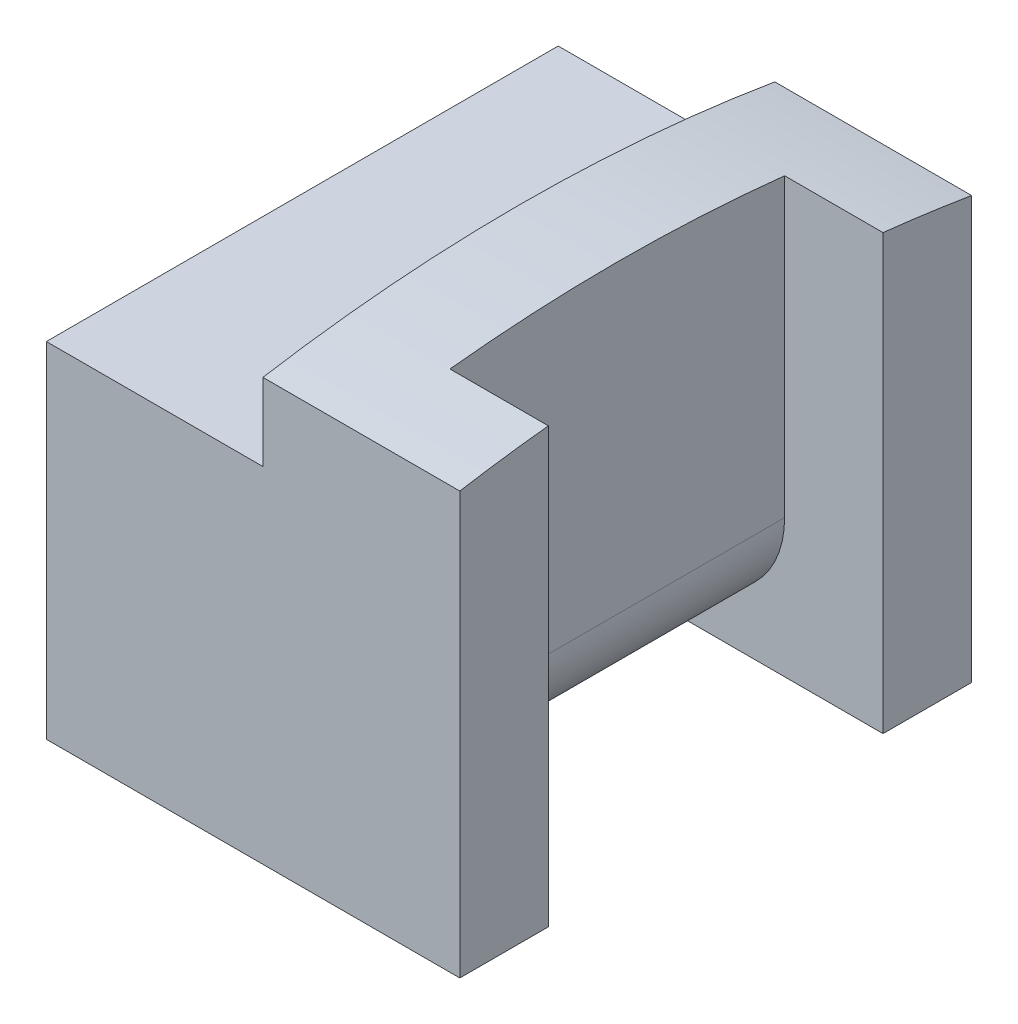
ISO-10303-21;
HEADER;
FILE_DESCRIPTION(('STEP AP214'),'2;1');
FILE_NAME('part.step','',(''),(''),'','','');
FILE_SCHEMA(('AUTOMOTIVE_DESIGN { 1 0 10303 214 1 1 1 1 }'));
ENDSEC;
DATA;
#1=APPLICATION_CONTEXT('core data for automotive mechanical design processes');
#2=APPLICATION_PROTOCOL_DEFINITION('international standard','automotive_design',2000,#1);
#3=PRODUCT_CONTEXT('',#1,'mechanical');
#4=PRODUCT('Part','Part','',(#3));
#5=PRODUCT_RELATED_PRODUCT_CATEGORY('part','',(#4));
#6=PRODUCT_DEFINITION_FORMATION('','',#4);
#7=PRODUCT_DEFINITION_CONTEXT('part definition',#1,'design');
#8=PRODUCT_DEFINITION('design','',#6,#7);
#9=PRODUCT_DEFINITION_SHAPE('','',#8);
#10=(LENGTH_UNIT() NAMED_UNIT(*) SI_UNIT(.MILLI.,.METRE.));
#11=(NAMED_UNIT(*) PLANE_ANGLE_UNIT() SI_UNIT($,.RADIAN.));
#12=(NAMED_UNIT(*) SI_UNIT($,.STERADIAN.) SOLID_ANGLE_UNIT());
#13=UNCERTAINTY_MEASURE_WITH_UNIT(LENGTH_MEASURE(1.E-05),#10,'distance_accuracy_value','');
#14=(GEOMETRIC_REPRESENTATION_CONTEXT(3) GLOBAL_UNCERTAINTY_ASSIGNED_CONTEXT((#13)) GLOBAL_UNIT_ASSIGNED_CONTEXT((#10,
#11,#12)) REPRESENTATION_CONTEXT('',''));
#15=CARTESIAN_POINT('',(0.,0.,0.));
#16=DIRECTION('',(0.,0.,1.));
#17=DIRECTION('',(1.,0.,0.));
#18=AXIS2_PLACEMENT_3D('',#15,#16,#17);
#19=CARTESIAN_POINT('',(59.6132183908046,6.7117816091954,-0.85));
#20=DIRECTION('',(0.,0.,-1.));
#21=DIRECTION('',(-1.,0.,0.));
#22=AXIS2_PLACEMENT_3D('',#19,#20,#21);
#23=PLANE('',#22);
#24=DIRECTION('',(0.,1.,0.));
#25=VECTOR('',#24,1.);
#26=CARTESIAN_POINT('',(60.1,6.35,-0.85));
#27=LINE('',#26,#25);
#28=CARTESIAN_POINT('',(60.1,6.35,-0.85));
#29=VERTEX_POINT('',#28);
#30=CARTESIAN_POINT('',(60.1,7.8541390362025,-0.85));
#31=VERTEX_POINT('',#30);
#32=EDGE_CURVE('E132',#29,#31,#27,.T.);
#33=ORIENTED_EDGE('',*,*,#32,.F.);
#34=CARTESIAN_POINT('',(59.6,6.35,-0.85));
#35=DIRECTION('',(0.,0.,1.));
#36=DIRECTION('',(1.,0.,0.));
#37=AXIS2_PLACEMENT_3D('',#34,#35,#36);
#38=CIRCLE('',#37,0.500000000000001);
#39=CARTESIAN_POINT('',(59.6,5.85,-0.85));
#40=VERTEX_POINT('',#39);
#41=EDGE_CURVE('E19',#40,#29,#38,.T.);
#42=ORIENTED_EDGE('',*,*,#41,.F.);
#43=DIRECTION('',(-1.,0.,0.));
#44=VECTOR('',#43,1.);
#45=CARTESIAN_POINT('',(59.6132183908046,5.85,-0.85));
#46=LINE('',#45,#44);
#47=CARTESIAN_POINT('',(58.5,5.85,-0.85));
#48=VERTEX_POINT('',#47);
#49=EDGE_CURVE('E109',#48,#40,#46,.F.);
#50=ORIENTED_EDGE('',*,*,#49,.F.);
#51=DIRECTION('',(0.,1.,0.));
#52=VECTOR('',#51,1.);
#53=CARTESIAN_POINT('',(58.5,6.7117816091954,-0.85));
#54=LINE('',#53,#52);
#55=CARTESIAN_POINT('',(58.5,5.65,-0.85));
#56=VERTEX_POINT('',#55);
#57=EDGE_CURVE('E117',#56,#48,#54,.T.);
#58=ORIENTED_EDGE('',*,*,#57,.F.);
#59=DIRECTION('',(1.,0.,0.));
#60=VECTOR('',#59,1.);
#61=CARTESIAN_POINT('',(58.5,5.65,-0.85));
#62=LINE('',#61,#60);
#63=CARTESIAN_POINT('',(60.6,5.65,-0.85));
#64=VERTEX_POINT('',#63);
#65=EDGE_CURVE('E152',#64,#56,#62,.F.);
#66=ORIENTED_EDGE('',*,*,#65,.F.);
#67=DIRECTION('',(0.,1.,0.));
#68=VECTOR('',#67,1.);
#69=CARTESIAN_POINT('',(60.6,5.65,-0.85));
#70=LINE('',#69,#68);
#71=CARTESIAN_POINT('',(60.6,7.8541390362025,-0.85));
#72=VERTEX_POINT('',#71);
#73=EDGE_CURVE('E183',#72,#64,#70,.F.);
#74=ORIENTED_EDGE('',*,*,#73,.F.);
#75=DIRECTION('',(-1.,0.,0.));
#76=VECTOR('',#75,1.);
#77=CARTESIAN_POINT('',(60.5,7.8541390362025,-0.85));
#78=LINE('',#77,#76);
#79=EDGE_CURVE('E158',#31,#72,#78,.F.);
#80=ORIENTED_EDGE('',*,*,#79,.F.);
#81=EDGE_LOOP('',(#33,#42,#50,#58,#66,#74,#80));
#82=FACE_BOUND('',#81,.T.);
#83=ADVANCED_FACE('F16',(#82),#23,.F.);
#84=CARTESIAN_POINT('',(59.6132183908046,6.7117816091954,0.85));
#85=DIRECTION('',(0.,0.,-1.));
#86=DIRECTION('',(-1.,0.,0.));
#87=AXIS2_PLACEMENT_3D('',#84,#85,#86);
#88=PLANE('',#87);
#89=CARTESIAN_POINT('',(59.6,6.35,0.85));
#90=DIRECTION('',(0.,0.,1.));
#91=DIRECTION('',(1.,0.,0.));
#92=AXIS2_PLACEMENT_3D('',#89,#90,#91);
#93=CIRCLE('',#92,0.500000000000001);
#94=CARTESIAN_POINT('',(60.1,6.35,0.85));
#95=VERTEX_POINT('',#94);
#96=CARTESIAN_POINT('',(59.6,5.85,0.85));
#97=VERTEX_POINT('',#96);
#98=EDGE_CURVE('E126',#95,#97,#93,.F.);
#99=ORIENTED_EDGE('',*,*,#98,.F.);
#100=DIRECTION('',(0.,1.,0.));
#101=VECTOR('',#100,1.);
#102=CARTESIAN_POINT('',(60.1,6.35,0.85));
#103=LINE('',#102,#101);
#104=CARTESIAN_POINT('',(60.1,7.85413903620251,0.85));
#105=VERTEX_POINT('',#104);
#106=EDGE_CURVE('E210',#105,#95,#103,.F.);
#107=ORIENTED_EDGE('',*,*,#106,.F.);
#108=DIRECTION('',(-1.,0.,0.));
#109=VECTOR('',#108,1.);
#110=CARTESIAN_POINT('',(59.6132183908046,7.85413903620251,0.85));
#111=LINE('',#110,#109);
#112=CARTESIAN_POINT('',(60.6,7.85413903620251,0.85));
#113=VERTEX_POINT('',#112);
#114=EDGE_CURVE('E134',#105,#113,#111,.F.);
#115=ORIENTED_EDGE('',*,*,#114,.T.);
#116=DIRECTION('',(0.,1.,0.));
#117=VECTOR('',#116,1.);
#118=CARTESIAN_POINT('',(60.6,5.65,0.85));
#119=LINE('',#118,#117);
#120=CARTESIAN_POINT('',(60.6,5.65,0.85));
#121=VERTEX_POINT('',#120);
#122=EDGE_CURVE('E181',#121,#113,#119,.T.);
#123=ORIENTED_EDGE('',*,*,#122,.F.);
#124=DIRECTION('',(1.,0.,0.));
#125=VECTOR('',#124,1.);
#126=CARTESIAN_POINT('',(58.5,5.65,0.85));
#127=LINE('',#126,#125);
#128=CARTESIAN_POINT('',(58.5,5.65,0.85));
#129=VERTEX_POINT('',#128);
#130=EDGE_CURVE('E212',#129,#121,#127,.T.);
#131=ORIENTED_EDGE('',*,*,#130,.F.);
#132=DIRECTION('',(0.,1.,0.));
#133=VECTOR('',#132,1.);
#134=CARTESIAN_POINT('',(58.5,6.7117816091954,0.85));
#135=LINE('',#134,#133);
#136=CARTESIAN_POINT('',(58.5,5.85,0.85));
#137=VERTEX_POINT('',#136);
#138=EDGE_CURVE('E135',#129,#137,#135,.T.);
#139=ORIENTED_EDGE('',*,*,#138,.T.);
#140=DIRECTION('',(-1.,0.,0.));
#141=VECTOR('',#140,1.);
#142=CARTESIAN_POINT('',(59.6132183908046,5.85,0.85));
#143=LINE('',#142,#141);
#144=EDGE_CURVE('E141',#137,#97,#143,.F.);
#145=ORIENTED_EDGE('',*,*,#144,.T.);
#146=EDGE_LOOP('',(#99,#107,#115,#123,#131,#139,#145));
#147=FACE_BOUND('',#146,.T.);
#148=ADVANCED_FACE('F317',(#147),#88,.T.);
#149=CARTESIAN_POINT('',(60.1,6.35,1.3));
#150=DIRECTION('',(1.,0.,0.));
#151=DIRECTION('',(0.,0.,-1.));
#152=AXIS2_PLACEMENT_3D('',#149,#150,#151);
#153=PLANE('',#152);
#154=DIRECTION('',(0.,0.,1.));
#155=VECTOR('',#154,1.);
#156=CARTESIAN_POINT('',(60.1,6.35,1.3));
#157=LINE('',#156,#155);
#158=EDGE_CURVE('E147',#29,#95,#157,.T.);
#159=ORIENTED_EDGE('',*,*,#158,.F.);
#160=ORIENTED_EDGE('',*,*,#32,.T.);
#161=CARTESIAN_POINT('',(60.1,0.,0.));
#162=DIRECTION('',(-1.,0.,0.));
#163=DIRECTION('',(0.,0.,1.));
#164=AXIS2_PLACEMENT_3D('',#161,#162,#163);
#165=CIRCLE('',#164,7.9);
#166=EDGE_CURVE('E175',#105,#31,#165,.T.);
#167=ORIENTED_EDGE('',*,*,#166,.F.);
#168=ORIENTED_EDGE('',*,*,#106,.T.);
#169=EDGE_LOOP('',(#159,#160,#167,#168));
#170=FACE_BOUND('',#169,.T.);
#171=ADVANCED_FACE('F320',(#170),#153,.T.);
#172=CARTESIAN_POINT('',(60.6,5.65,-0.85));
#173=DIRECTION('',(1.,0.,0.));
#174=DIRECTION('',(0.,0.,-1.));
#175=AXIS2_PLACEMENT_3D('',#172,#173,#174);
#176=PLANE('',#175);
#177=DIRECTION('',(0.,0.,-1.));
#178=VECTOR('',#177,1.);
#179=CARTESIAN_POINT('',(60.6,5.65,-0.85));
#180=LINE('',#179,#178);
#181=CARTESIAN_POINT('',(60.6,5.65,-1.3));
#182=VERTEX_POINT('',#181);
#183=EDGE_CURVE('E155',#182,#64,#180,.F.);
#184=ORIENTED_EDGE('',*,*,#183,.F.);
#185=DIRECTION('',(0.,1.,0.));
#186=VECTOR('',#185,1.);
#187=CARTESIAN_POINT('',(60.6,6.7117816091954,-1.3));
#188=LINE('',#187,#186);
#189=CARTESIAN_POINT('',(60.6,7.79230389551126,-1.3));
#190=VERTEX_POINT('',#189);
#191=EDGE_CURVE('E197',#190,#182,#188,.F.);
#192=ORIENTED_EDGE('',*,*,#191,.F.);
#193=CARTESIAN_POINT('',(60.6,0.,0.));
#194=DIRECTION('',(-1.,0.,0.));
#195=DIRECTION('',(0.,0.,1.));
#196=AXIS2_PLACEMENT_3D('',#193,#194,#195);
#197=CIRCLE('',#196,7.9);
#198=EDGE_CURVE('E160',#190,#72,#197,.F.);
#199=ORIENTED_EDGE('',*,*,#198,.T.);
#200=ORIENTED_EDGE('',*,*,#73,.T.);
#201=EDGE_LOOP('',(#184,#192,#199,#200));
#202=FACE_BOUND('',#201,.T.);
#203=ADVANCED_FACE('F321',(#202),#176,.T.);
#204=CARTESIAN_POINT('',(58.5,5.65,-0.85));
#205=DIRECTION('',(0.,-1.,0.));
#206=DIRECTION('',(0.,0.,-1.));
#207=AXIS2_PLACEMENT_3D('',#204,#205,#206);
#208=PLANE('',#207);
#209=ORIENTED_EDGE('',*,*,#65,.T.);
#210=DIRECTION('',(0.,0.,-1.));
#211=VECTOR('',#210,1.);
#212=CARTESIAN_POINT('',(58.5,5.65,-0.85));
#213=LINE('',#212,#211);
#214=CARTESIAN_POINT('',(58.5,5.65,-1.3));
#215=VERTEX_POINT('',#214);
#216=EDGE_CURVE('E148',#56,#215,#213,.T.);
#217=ORIENTED_EDGE('',*,*,#216,.T.);
#218=DIRECTION('',(-1.,0.,0.));
#219=VECTOR('',#218,1.);
#220=CARTESIAN_POINT('',(59.6132183908046,5.65,-1.3));
#221=LINE('',#220,#219);
#222=EDGE_CURVE('E200',#182,#215,#221,.T.);
#223=ORIENTED_EDGE('',*,*,#222,.F.);
#224=ORIENTED_EDGE('',*,*,#183,.T.);
#225=EDGE_LOOP('',(#209,#217,#223,#224));
#226=FACE_BOUND('',#225,.T.);
#227=ADVANCED_FACE('F315',(#226),#208,.T.);
#228=CARTESIAN_POINT('',(59.6,6.35,1.3));
#229=DIRECTION('',(0.,0.,1.));
#230=DIRECTION('',(1.,0.,0.));
#231=AXIS2_PLACEMENT_3D('',#228,#229,#230);
#232=CYLINDRICAL_SURFACE('',#231,0.500000000000001);
#233=ORIENTED_EDGE('',*,*,#98,.T.);
#234=DIRECTION('',(0.,0.,-1.));
#235=VECTOR('',#234,1.);
#236=CARTESIAN_POINT('',(59.6,5.85,1.3));
#237=LINE('',#236,#235);
#238=EDGE_CURVE('E112',#40,#97,#237,.F.);
#239=ORIENTED_EDGE('',*,*,#238,.F.);
#240=ORIENTED_EDGE('',*,*,#41,.T.);
#241=ORIENTED_EDGE('',*,*,#158,.T.);
#242=EDGE_LOOP('',(#233,#239,#240,#241));
#243=FACE_BOUND('',#242,.T.);
#244=ADVANCED_FACE('F122',(#243),#232,.T.);
#245=CARTESIAN_POINT('',(60.6,5.65,1.3));
#246=DIRECTION('',(1.,0.,0.));
#247=DIRECTION('',(0.,0.,-1.));
#248=AXIS2_PLACEMENT_3D('',#245,#246,#247);
#249=PLANE('',#248);
#250=DIRECTION('',(0.,0.,-1.));
#251=VECTOR('',#250,1.);
#252=CARTESIAN_POINT('',(60.6,5.65,1.3));
#253=LINE('',#252,#251);
#254=CARTESIAN_POINT('',(60.6,5.65,1.3));
#255=VERTEX_POINT('',#254);
#256=EDGE_CURVE('E215',#121,#255,#253,.F.);
#257=ORIENTED_EDGE('',*,*,#256,.F.);
#258=ORIENTED_EDGE('',*,*,#122,.T.);
#259=CARTESIAN_POINT('',(60.6,0.,0.));
#260=DIRECTION('',(-1.,0.,0.));
#261=DIRECTION('',(0.,0.,1.));
#262=AXIS2_PLACEMENT_3D('',#259,#260,#261);
#263=CIRCLE('',#262,7.9);
#264=CARTESIAN_POINT('',(60.6,7.79230389551126,1.3));
#265=VERTEX_POINT('',#264);
#266=EDGE_CURVE('E177',#265,#113,#263,.T.);
#267=ORIENTED_EDGE('',*,*,#266,.F.);
#268=DIRECTION('',(0.,1.,0.));
#269=VECTOR('',#268,1.);
#270=CARTESIAN_POINT('',(60.6,6.7117816091954,1.3));
#271=LINE('',#270,#269);
#272=EDGE_CURVE('E127',#265,#255,#271,.F.);
#273=ORIENTED_EDGE('',*,*,#272,.T.);
#274=EDGE_LOOP('',(#257,#258,#267,#273));
#275=FACE_BOUND('',#274,.T.);
#276=ADVANCED_FACE('F271',(#275),#249,.T.);
#277=CARTESIAN_POINT('',(58.5,5.65,1.3));
#278=DIRECTION('',(0.,-1.,0.));
#279=DIRECTION('',(0.,0.,-1.));
#280=AXIS2_PLACEMENT_3D('',#277,#278,#279);
#281=PLANE('',#280);
#282=DIRECTION('',(-1.,0.,0.));
#283=VECTOR('',#282,1.);
#284=CARTESIAN_POINT('',(59.6132183908046,5.65,1.3));
#285=LINE('',#284,#283);
#286=CARTESIAN_POINT('',(58.5,5.65,1.3));
#287=VERTEX_POINT('',#286);
#288=EDGE_CURVE('E235',#255,#287,#285,.T.);
#289=ORIENTED_EDGE('',*,*,#288,.T.);
#290=DIRECTION('',(0.,0.,-1.));
#291=VECTOR('',#290,1.);
#292=CARTESIAN_POINT('',(58.5,5.65,1.3));
#293=LINE('',#292,#291);
#294=EDGE_CURVE('E180',#287,#129,#293,.T.);
#295=ORIENTED_EDGE('',*,*,#294,.T.);
#296=ORIENTED_EDGE('',*,*,#130,.T.);
#297=ORIENTED_EDGE('',*,*,#256,.T.);
#298=EDGE_LOOP('',(#289,#295,#296,#297));
#299=FACE_BOUND('',#298,.T.);
#300=ADVANCED_FACE('F274',(#299),#281,.T.);
#301=CARTESIAN_POINT('',(60.5,0.,0.));
#302=DIRECTION('',(-1.,0.,0.));
#303=DIRECTION('',(0.,0.,1.));
#304=AXIS2_PLACEMENT_3D('',#301,#302,#303);
#305=CYLINDRICAL_SURFACE('',#304,7.9);
#306=ORIENTED_EDGE('',*,*,#114,.F.);
#307=ORIENTED_EDGE('',*,*,#166,.T.);
#308=ORIENTED_EDGE('',*,*,#79,.T.);
#309=ORIENTED_EDGE('',*,*,#198,.F.);
#310=DIRECTION('',(-1.,0.,0.));
#311=VECTOR('',#310,1.);
#312=CARTESIAN_POINT('',(59.6132183908046,7.79230389551126,-1.3));
#313=LINE('',#312,#311);
#314=CARTESIAN_POINT('',(59.6,7.79230389551126,-1.3));
#315=VERTEX_POINT('',#314);
#316=EDGE_CURVE('E174',#315,#190,#313,.F.);
#317=ORIENTED_EDGE('',*,*,#316,.F.);
#318=CARTESIAN_POINT('',(59.6,0.,0.));
#319=DIRECTION('',(-1.,0.,0.));
#320=DIRECTION('',(0.,0.,1.));
#321=AXIS2_PLACEMENT_3D('',#318,#319,#320);
#322=CIRCLE('',#321,7.9);
#323=CARTESIAN_POINT('',(59.6,7.79230389551126,1.3));
#324=VERTEX_POINT('',#323);
#325=EDGE_CURVE('E171',#324,#315,#322,.T.);
#326=ORIENTED_EDGE('',*,*,#325,.F.);
#327=DIRECTION('',(-1.,0.,0.));
#328=VECTOR('',#327,1.);
#329=CARTESIAN_POINT('',(59.6132183908046,7.79230389551126,1.3));
#330=LINE('',#329,#328);
#331=EDGE_CURVE('E247',#324,#265,#330,.F.);
#332=ORIENTED_EDGE('',*,*,#331,.T.);
#333=ORIENTED_EDGE('',*,*,#266,.T.);
#334=EDGE_LOOP('',(#306,#307,#308,#309,#317,#326,#332,#333));
#335=FACE_BOUND('',#334,.T.);
#336=ADVANCED_FACE('F276',(#335),#305,.T.);
#337=CARTESIAN_POINT('',(59.6,7.9,-0.85));
#338=DIRECTION('',(-1.,0.,0.));
#339=DIRECTION('',(0.,0.,1.));
#340=AXIS2_PLACEMENT_3D('',#337,#338,#339);
#341=PLANE('',#340);
#342=DIRECTION('',(0.,0.,1.));
#343=VECTOR('',#342,1.);
#344=CARTESIAN_POINT('',(59.6,7.4,-0.85));
#345=LINE('',#344,#343);
#346=CARTESIAN_POINT('',(59.6,7.4,1.3));
#347=VERTEX_POINT('',#346);
#348=CARTESIAN_POINT('',(59.6,7.4,-1.3));
#349=VERTEX_POINT('',#348);
#350=EDGE_CURVE('E251',#347,#349,#345,.F.);
#351=ORIENTED_EDGE('',*,*,#350,.F.);
#352=DIRECTION('',(0.,1.,0.));
#353=VECTOR('',#352,1.);
#354=CARTESIAN_POINT('',(59.6,6.7117816091954,1.3));
#355=LINE('',#354,#353);
#356=EDGE_CURVE('E237',#347,#324,#355,.T.);
#357=ORIENTED_EDGE('',*,*,#356,.T.);
#358=ORIENTED_EDGE('',*,*,#325,.T.);
#359=DIRECTION('',(0.,1.,0.));
#360=VECTOR('',#359,1.);
#361=CARTESIAN_POINT('',(59.6,6.7117816091954,-1.3));
#362=LINE('',#361,#360);
#363=EDGE_CURVE('E128',#349,#315,#362,.T.);
#364=ORIENTED_EDGE('',*,*,#363,.F.);
#365=EDGE_LOOP('',(#351,#357,#358,#364));
#366=FACE_BOUND('',#365,.T.);
#367=ADVANCED_FACE('F283',(#366),#341,.T.);
#368=CARTESIAN_POINT('',(59.6132183908046,6.7117816091954,-1.3));
#369=DIRECTION('',(0.,0.,-1.));
#370=DIRECTION('',(-1.,0.,0.));
#371=AXIS2_PLACEMENT_3D('',#368,#369,#370);
#372=PLANE('',#371);
#373=DIRECTION('',(1.,0.,0.));
#374=VECTOR('',#373,1.);
#375=CARTESIAN_POINT('',(59.6,7.4,-1.3));
#376=LINE('',#375,#374);
#377=CARTESIAN_POINT('',(58.5,7.4,-1.3));
#378=VERTEX_POINT('',#377);
#379=EDGE_CURVE('E245',#349,#378,#376,.F.);
#380=ORIENTED_EDGE('',*,*,#379,.F.);
#381=ORIENTED_EDGE('',*,*,#363,.T.);
#382=ORIENTED_EDGE('',*,*,#316,.T.);
#383=ORIENTED_EDGE('',*,*,#191,.T.);
#384=ORIENTED_EDGE('',*,*,#222,.T.);
#385=DIRECTION('',(0.,1.,0.));
#386=VECTOR('',#385,1.);
#387=CARTESIAN_POINT('',(58.5,7.4,-1.3));
#388=LINE('',#387,#386);
#389=EDGE_CURVE('E162',#378,#215,#388,.F.);
#390=ORIENTED_EDGE('',*,*,#389,.F.);
#391=EDGE_LOOP('',(#380,#381,#382,#383,#384,#390));
#392=FACE_BOUND('',#391,.T.);
#393=ADVANCED_FACE('F300',(#392),#372,.T.);
#394=CARTESIAN_POINT('',(58.5,5.85,1.3));
#395=DIRECTION('',(0.,-1.,0.));
#396=DIRECTION('',(0.,0.,-1.));
#397=AXIS2_PLACEMENT_3D('',#394,#395,#396);
#398=PLANE('',#397);
#399=ORIENTED_EDGE('',*,*,#144,.F.);
#400=DIRECTION('',(0.,0.,1.));
#401=VECTOR('',#400,1.);
#402=CARTESIAN_POINT('',(58.5,5.85,-0.85));
#403=LINE('',#402,#401);
#404=EDGE_CURVE('E114',#48,#137,#403,.T.);
#405=ORIENTED_EDGE('',*,*,#404,.F.);
#406=ORIENTED_EDGE('',*,*,#49,.T.);
#407=ORIENTED_EDGE('',*,*,#238,.T.);
#408=EDGE_LOOP('',(#399,#405,#406,#407));
#409=FACE_BOUND('',#408,.T.);
#410=ADVANCED_FACE('F111',(#409),#398,.T.);
#411=CARTESIAN_POINT('',(59.6132183908046,6.7117816091954,1.3));
#412=DIRECTION('',(0.,0.,-1.));
#413=DIRECTION('',(-1.,0.,0.));
#414=AXIS2_PLACEMENT_3D('',#411,#412,#413);
#415=PLANE('',#414);
#416=ORIENTED_EDGE('',*,*,#356,.F.);
#417=DIRECTION('',(1.,0.,0.));
#418=VECTOR('',#417,1.);
#419=CARTESIAN_POINT('',(59.6,7.4,1.3));
#420=LINE('',#419,#418);
#421=CARTESIAN_POINT('',(58.5,7.4,1.3));
#422=VERTEX_POINT('',#421);
#423=EDGE_CURVE('E34',#422,#347,#420,.T.);
#424=ORIENTED_EDGE('',*,*,#423,.F.);
#425=DIRECTION('',(0.,1.,0.));
#426=VECTOR('',#425,1.);
#427=CARTESIAN_POINT('',(58.5,7.4,1.3));
#428=LINE('',#427,#426);
#429=EDGE_CURVE('E25',#287,#422,#428,.T.);
#430=ORIENTED_EDGE('',*,*,#429,.F.);
#431=ORIENTED_EDGE('',*,*,#288,.F.);
#432=ORIENTED_EDGE('',*,*,#272,.F.);
#433=ORIENTED_EDGE('',*,*,#331,.F.);
#434=EDGE_LOOP('',(#416,#424,#430,#431,#432,#433));
#435=FACE_BOUND('',#434,.T.);
#436=ADVANCED_FACE('F272',(#435),#415,.F.);
#437=CARTESIAN_POINT('',(59.6,7.4,-0.85));
#438=DIRECTION('',(0.,1.,0.));
#439=DIRECTION('',(0.,0.,1.));
#440=AXIS2_PLACEMENT_3D('',#437,#438,#439);
#441=PLANE('',#440);
#442=ORIENTED_EDGE('',*,*,#423,.T.);
#443=ORIENTED_EDGE('',*,*,#350,.T.);
#444=ORIENTED_EDGE('',*,*,#379,.T.);
#445=DIRECTION('',(0.,0.,1.));
#446=VECTOR('',#445,1.);
#447=CARTESIAN_POINT('',(58.5,7.4,-0.85));
#448=LINE('',#447,#446);
#449=EDGE_CURVE('E11',#422,#378,#448,.F.);
#450=ORIENTED_EDGE('',*,*,#449,.F.);
#451=EDGE_LOOP('',(#442,#443,#444,#450));
#452=FACE_BOUND('',#451,.T.);
#453=ADVANCED_FACE('F288',(#452),#441,.T.);
#454=CARTESIAN_POINT('',(58.5,7.4,-0.85));
#455=DIRECTION('',(-1.,0.,0.));
#456=DIRECTION('',(0.,0.,1.));
#457=AXIS2_PLACEMENT_3D('',#454,#455,#456);
#458=PLANE('',#457);
#459=ORIENTED_EDGE('',*,*,#429,.T.);
#460=ORIENTED_EDGE('',*,*,#449,.T.);
#461=ORIENTED_EDGE('',*,*,#389,.T.);
#462=ORIENTED_EDGE('',*,*,#216,.F.);
#463=ORIENTED_EDGE('',*,*,#57,.T.);
#464=ORIENTED_EDGE('',*,*,#404,.T.);
#465=ORIENTED_EDGE('',*,*,#138,.F.);
#466=ORIENTED_EDGE('',*,*,#294,.F.);
#467=EDGE_LOOP('',(#459,#460,#461,#462,#463,#464,#465,#466));
#468=FACE_BOUND('',#467,.T.);
#469=ADVANCED_FACE('F286',(#468),#458,.T.);
#470=CLOSED_SHELL('',(#83,#148,#171,#203,#227,#244,#276,#300,#336,#367,#393,#410,#436,#453,#469));
#471=MANIFOLD_SOLID_BREP('B1',#470);
#472=ADVANCED_BREP_SHAPE_REPRESENTATION('',(#18,#471),#14);
#473=SHAPE_DEFINITION_REPRESENTATION(#9,#472);
ENDSEC;
END-ISO-10303-21;
